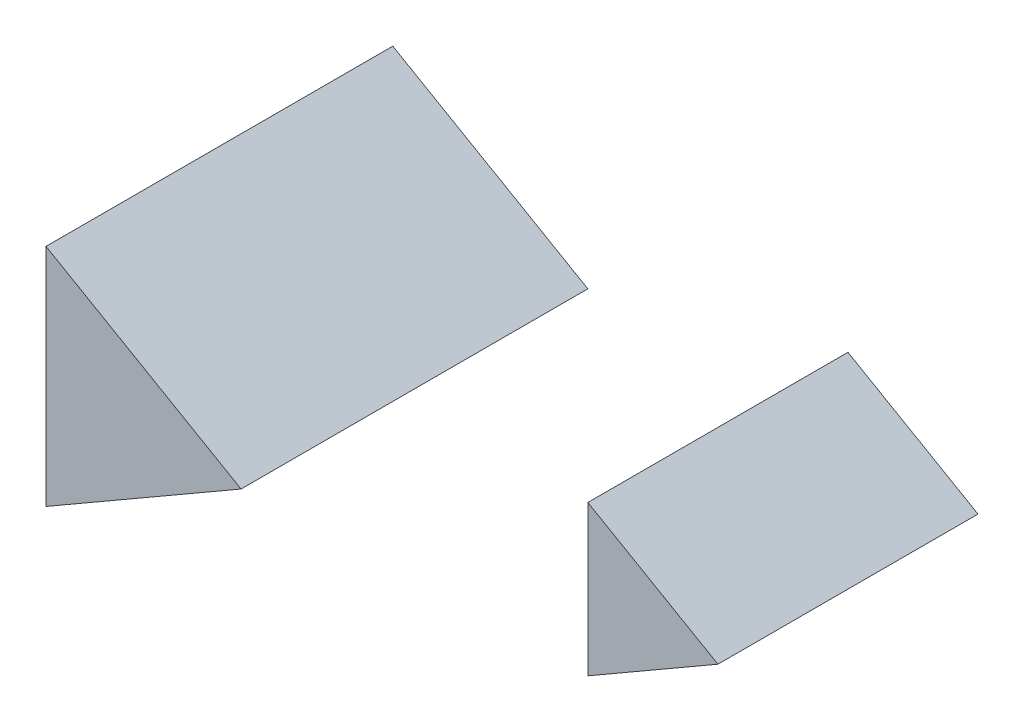
ISO-10303-21;
HEADER;
FILE_DESCRIPTION(('STEP AP214'),'2;1');
FILE_NAME('part.step','',(''),(''),'','','');
FILE_SCHEMA(('AUTOMOTIVE_DESIGN { 1 0 10303 214 1 1 1 1 }'));
ENDSEC;
DATA;
#1=APPLICATION_CONTEXT('core data for automotive mechanical design processes');
#2=APPLICATION_PROTOCOL_DEFINITION('international standard','automotive_design',2000,#1);
#3=PRODUCT_CONTEXT('',#1,'mechanical');
#4=PRODUCT('Part','Part','',(#3));
#5=PRODUCT_RELATED_PRODUCT_CATEGORY('part','',(#4));
#6=PRODUCT_DEFINITION_FORMATION('','',#4);
#7=PRODUCT_DEFINITION_CONTEXT('part definition',#1,'design');
#8=PRODUCT_DEFINITION('design','',#6,#7);
#9=PRODUCT_DEFINITION_SHAPE('','',#8);
#10=(LENGTH_UNIT() NAMED_UNIT(*) SI_UNIT(.MILLI.,.METRE.));
#11=(NAMED_UNIT(*) PLANE_ANGLE_UNIT() SI_UNIT($,.RADIAN.));
#12=(NAMED_UNIT(*) SI_UNIT($,.STERADIAN.) SOLID_ANGLE_UNIT());
#13=UNCERTAINTY_MEASURE_WITH_UNIT(LENGTH_MEASURE(1.E-05),#10,'distance_accuracy_value','');
#14=(GEOMETRIC_REPRESENTATION_CONTEXT(3) GLOBAL_UNCERTAINTY_ASSIGNED_CONTEXT((#13)) GLOBAL_UNIT_ASSIGNED_CONTEXT((#10,
#11,#12)) REPRESENTATION_CONTEXT('',''));
#15=CARTESIAN_POINT('',(0.,0.,0.));
#16=DIRECTION('',(0.,0.,1.));
#17=DIRECTION('',(1.,0.,0.));
#18=AXIS2_PLACEMENT_3D('',#15,#16,#17);
#19=CARTESIAN_POINT('',(400.000000000002,-173.205080756889,600.));
#20=DIRECTION('',(-0.500000000000004,0.866025403784436,0.));
#21=DIRECTION('',(-0.866025403784436,-0.500000000000004,0.));
#22=AXIS2_PLACEMENT_3D('',#19,#20,#21);
#23=PLANE('',#22);
#24=DIRECTION('',(0.866025403784436,0.500000000000004,0.));
#25=VECTOR('',#24,1.);
#26=CARTESIAN_POINT('',(400.000000000002,-173.205080756889,0.));
#27=LINE('',#26,#25);
#28=CARTESIAN_POINT('',(400.000000000002,-173.205080756889,0.));
#29=VERTEX_POINT('',#28);
#30=CARTESIAN_POINT('',(700.,0.,0.));
#31=VERTEX_POINT('',#30);
#32=EDGE_CURVE('E98',#29,#31,#27,.T.);
#33=ORIENTED_EDGE('',*,*,#32,.T.);
#34=DIRECTION('',(0.,0.,-1.));
#35=VECTOR('',#34,1.);
#36=CARTESIAN_POINT('',(700.,0.,600.));
#37=LINE('',#36,#35);
#38=CARTESIAN_POINT('',(700.,0.,600.));
#39=VERTEX_POINT('',#38);
#40=EDGE_CURVE('E12',#39,#31,#37,.T.);
#41=ORIENTED_EDGE('',*,*,#40,.F.);
#42=DIRECTION('',(0.866025403784436,0.500000000000004,0.));
#43=VECTOR('',#42,1.);
#44=CARTESIAN_POINT('',(400.000000000002,-173.205080756889,600.));
#45=LINE('',#44,#43);
#46=CARTESIAN_POINT('',(400.000000000002,-173.205080756889,600.));
#47=VERTEX_POINT('',#46);
#48=EDGE_CURVE('E91',#47,#39,#45,.T.);
#49=ORIENTED_EDGE('',*,*,#48,.F.);
#50=DIRECTION('',(0.,0.,-1.));
#51=VECTOR('',#50,1.);
#52=CARTESIAN_POINT('',(400.000000000002,-173.205080756889,600.));
#53=LINE('',#52,#51);
#54=EDGE_CURVE('E99',#47,#29,#53,.T.);
#55=ORIENTED_EDGE('',*,*,#54,.T.);
#56=EDGE_LOOP('',(#33,#41,#49,#55));
#57=FACE_BOUND('',#56,.T.);
#58=ADVANCED_FACE('F51',(#57),#23,.F.);
#59=CARTESIAN_POINT('',(700.,0.,600.));
#60=DIRECTION('',(-0.499999999999998,-0.86602540378444,0.));
#61=DIRECTION('',(0.86602540378444,-0.499999999999998,0.));
#62=AXIS2_PLACEMENT_3D('',#59,#60,#61);
#63=PLANE('',#62);
#64=DIRECTION('',(-0.86602540378444,0.499999999999998,0.));
#65=VECTOR('',#64,1.);
#66=CARTESIAN_POINT('',(700.,0.,0.));
#67=LINE('',#66,#65);
#68=CARTESIAN_POINT('',(399.999999999999,173.205080756887,0.));
#69=VERTEX_POINT('',#68);
#70=EDGE_CURVE('E79',#31,#69,#67,.T.);
#71=ORIENTED_EDGE('',*,*,#70,.T.);
#72=DIRECTION('',(0.,0.,-1.));
#73=VECTOR('',#72,1.);
#74=CARTESIAN_POINT('',(399.999999999999,173.205080756887,600.));
#75=LINE('',#74,#73);
#76=CARTESIAN_POINT('',(399.999999999999,173.205080756887,600.));
#77=VERTEX_POINT('',#76);
#78=EDGE_CURVE('E59',#77,#69,#75,.T.);
#79=ORIENTED_EDGE('',*,*,#78,.F.);
#80=DIRECTION('',(-0.86602540378444,0.499999999999998,0.));
#81=VECTOR('',#80,1.);
#82=CARTESIAN_POINT('',(700.,0.,600.));
#83=LINE('',#82,#81);
#84=EDGE_CURVE('E87',#39,#77,#83,.T.);
#85=ORIENTED_EDGE('',*,*,#84,.F.);
#86=ORIENTED_EDGE('',*,*,#40,.T.);
#87=EDGE_LOOP('',(#71,#79,#85,#86));
#88=FACE_BOUND('',#87,.T.);
#89=ADVANCED_FACE('F88',(#88),#63,.F.);
#90=CARTESIAN_POINT('',(399.999999999999,173.205080756887,600.));
#91=DIRECTION('',(1.,0.,0.));
#92=DIRECTION('',(0.,1.,0.));
#93=AXIS2_PLACEMENT_3D('',#90,#91,#92);
#94=PLANE('',#93);
#95=DIRECTION('',(0.,-1.,0.));
#96=VECTOR('',#95,1.);
#97=CARTESIAN_POINT('',(399.999999999999,173.205080756887,0.));
#98=LINE('',#97,#96);
#99=EDGE_CURVE('E84',#69,#29,#98,.T.);
#100=ORIENTED_EDGE('',*,*,#99,.T.);
#101=ORIENTED_EDGE('',*,*,#54,.F.);
#102=DIRECTION('',(0.,-1.,0.));
#103=VECTOR('',#102,1.);
#104=CARTESIAN_POINT('',(399.999999999999,173.205080756887,600.));
#105=LINE('',#104,#103);
#106=EDGE_CURVE('E67',#77,#47,#105,.T.);
#107=ORIENTED_EDGE('',*,*,#106,.F.);
#108=ORIENTED_EDGE('',*,*,#78,.T.);
#109=EDGE_LOOP('',(#100,#101,#107,#108));
#110=FACE_BOUND('',#109,.T.);
#111=ADVANCED_FACE('F106',(#110),#94,.F.);
#112=CARTESIAN_POINT('',(0.,0.,600.));
#113=DIRECTION('',(0.,0.,1.));
#114=DIRECTION('',(1.,0.,0.));
#115=AXIS2_PLACEMENT_3D('',#112,#113,#114);
#116=PLANE('',#115);
#117=ORIENTED_EDGE('',*,*,#48,.T.);
#118=ORIENTED_EDGE('',*,*,#84,.T.);
#119=ORIENTED_EDGE('',*,*,#106,.T.);
#120=EDGE_LOOP('',(#117,#118,#119));
#121=FACE_BOUND('',#120,.T.);
#122=ADVANCED_FACE('F94',(#121),#116,.T.);
#123=CARTESIAN_POINT('',(0.,0.,0.));
#124=DIRECTION('',(0.,0.,1.));
#125=DIRECTION('',(1.,0.,0.));
#126=AXIS2_PLACEMENT_3D('',#123,#124,#125);
#127=PLANE('',#126);
#128=ORIENTED_EDGE('',*,*,#32,.F.);
#129=ORIENTED_EDGE('',*,*,#99,.F.);
#130=ORIENTED_EDGE('',*,*,#70,.F.);
#131=EDGE_LOOP('',(#128,#129,#130));
#132=FACE_BOUND('',#131,.T.);
#133=ADVANCED_FACE('F107',(#132),#127,.F.);
#134=CLOSED_SHELL('',(#58,#89,#111,#122,#133));
#135=MANIFOLD_SOLID_BREP('B2',#134);
#136=CARTESIAN_POINT('',(-649.999999999998,-259.807621135333,800.));
#137=DIRECTION('',(-0.500000000000004,0.866025403784436,0.));
#138=DIRECTION('',(-0.866025403784436,-0.500000000000004,0.));
#139=AXIS2_PLACEMENT_3D('',#136,#137,#138);
#140=PLANE('',#139);
#141=DIRECTION('',(0.866025403784436,0.500000000000004,0.));
#142=VECTOR('',#141,1.);
#143=CARTESIAN_POINT('',(-649.999999999998,-259.807621135333,0.));
#144=LINE('',#143,#142);
#145=CARTESIAN_POINT('',(-649.999999999998,-259.807621135333,0.));
#146=VERTEX_POINT('',#145);
#147=CARTESIAN_POINT('',(-200.,0.,0.));
#148=VERTEX_POINT('',#147);
#149=EDGE_CURVE('E196',#146,#148,#144,.T.);
#150=ORIENTED_EDGE('',*,*,#149,.T.);
#151=DIRECTION('',(0.,0.,-1.));
#152=VECTOR('',#151,1.);
#153=CARTESIAN_POINT('',(-200.,0.,800.));
#154=LINE('',#153,#152);
#155=CARTESIAN_POINT('',(-200.,0.,800.));
#156=VERTEX_POINT('',#155);
#157=EDGE_CURVE('E49',#156,#148,#154,.T.);
#158=ORIENTED_EDGE('',*,*,#157,.F.);
#159=DIRECTION('',(0.866025403784436,0.500000000000004,0.));
#160=VECTOR('',#159,1.);
#161=CARTESIAN_POINT('',(-649.999999999998,-259.807621135333,800.));
#162=LINE('',#161,#160);
#163=CARTESIAN_POINT('',(-649.999999999998,-259.807621135333,800.));
#164=VERTEX_POINT('',#163);
#165=EDGE_CURVE('E189',#164,#156,#162,.T.);
#166=ORIENTED_EDGE('',*,*,#165,.F.);
#167=DIRECTION('',(0.,0.,-1.));
#168=VECTOR('',#167,1.);
#169=CARTESIAN_POINT('',(-649.999999999998,-259.807621135333,800.));
#170=LINE('',#169,#168);
#171=EDGE_CURVE('E197',#164,#146,#170,.T.);
#172=ORIENTED_EDGE('',*,*,#171,.T.);
#173=EDGE_LOOP('',(#150,#158,#166,#172));
#174=FACE_BOUND('',#173,.T.);
#175=ADVANCED_FACE('F149',(#174),#140,.F.);
#176=CARTESIAN_POINT('',(-200.,0.,800.));
#177=DIRECTION('',(-0.499999999999998,-0.86602540378444,0.));
#178=DIRECTION('',(0.86602540378444,-0.499999999999998,0.));
#179=AXIS2_PLACEMENT_3D('',#176,#177,#178);
#180=PLANE('',#179);
#181=DIRECTION('',(-0.86602540378444,0.499999999999998,0.));
#182=VECTOR('',#181,1.);
#183=CARTESIAN_POINT('',(-200.,0.,0.));
#184=LINE('',#183,#182);
#185=CARTESIAN_POINT('',(-650.000000000001,259.807621135331,0.));
#186=VERTEX_POINT('',#185);
#187=EDGE_CURVE('E177',#148,#186,#184,.T.);
#188=ORIENTED_EDGE('',*,*,#187,.T.);
#189=DIRECTION('',(0.,0.,-1.));
#190=VECTOR('',#189,1.);
#191=CARTESIAN_POINT('',(-650.000000000001,259.807621135331,800.));
#192=LINE('',#191,#190);
#193=CARTESIAN_POINT('',(-650.000000000001,259.807621135331,800.));
#194=VERTEX_POINT('',#193);
#195=EDGE_CURVE('E157',#194,#186,#192,.T.);
#196=ORIENTED_EDGE('',*,*,#195,.F.);
#197=DIRECTION('',(-0.86602540378444,0.499999999999998,0.));
#198=VECTOR('',#197,1.);
#199=CARTESIAN_POINT('',(-200.,0.,800.));
#200=LINE('',#199,#198);
#201=EDGE_CURVE('E185',#156,#194,#200,.T.);
#202=ORIENTED_EDGE('',*,*,#201,.F.);
#203=ORIENTED_EDGE('',*,*,#157,.T.);
#204=EDGE_LOOP('',(#188,#196,#202,#203));
#205=FACE_BOUND('',#204,.T.);
#206=ADVANCED_FACE('F186',(#205),#180,.F.);
#207=CARTESIAN_POINT('',(-650.000000000001,259.807621135331,800.));
#208=DIRECTION('',(1.,0.,0.));
#209=DIRECTION('',(0.,1.,0.));
#210=AXIS2_PLACEMENT_3D('',#207,#208,#209);
#211=PLANE('',#210);
#212=DIRECTION('',(0.,-1.,0.));
#213=VECTOR('',#212,1.);
#214=CARTESIAN_POINT('',(-650.000000000001,259.807621135331,0.));
#215=LINE('',#214,#213);
#216=EDGE_CURVE('E182',#186,#146,#215,.T.);
#217=ORIENTED_EDGE('',*,*,#216,.T.);
#218=ORIENTED_EDGE('',*,*,#171,.F.);
#219=DIRECTION('',(0.,-1.,0.));
#220=VECTOR('',#219,1.);
#221=CARTESIAN_POINT('',(-650.000000000001,259.807621135331,800.));
#222=LINE('',#221,#220);
#223=EDGE_CURVE('E165',#194,#164,#222,.T.);
#224=ORIENTED_EDGE('',*,*,#223,.F.);
#225=ORIENTED_EDGE('',*,*,#195,.T.);
#226=EDGE_LOOP('',(#217,#218,#224,#225));
#227=FACE_BOUND('',#226,.T.);
#228=ADVANCED_FACE('F204',(#227),#211,.F.);
#229=CARTESIAN_POINT('',(0.,0.,800.));
#230=DIRECTION('',(0.,0.,1.));
#231=DIRECTION('',(1.,0.,0.));
#232=AXIS2_PLACEMENT_3D('',#229,#230,#231);
#233=PLANE('',#232);
#234=ORIENTED_EDGE('',*,*,#165,.T.);
#235=ORIENTED_EDGE('',*,*,#201,.T.);
#236=ORIENTED_EDGE('',*,*,#223,.T.);
#237=EDGE_LOOP('',(#234,#235,#236));
#238=FACE_BOUND('',#237,.T.);
#239=ADVANCED_FACE('F192',(#238),#233,.T.);
#240=CARTESIAN_POINT('',(0.,0.,0.));
#241=DIRECTION('',(0.,0.,1.));
#242=DIRECTION('',(1.,0.,0.));
#243=AXIS2_PLACEMENT_3D('',#240,#241,#242);
#244=PLANE('',#243);
#245=ORIENTED_EDGE('',*,*,#149,.F.);
#246=ORIENTED_EDGE('',*,*,#216,.F.);
#247=ORIENTED_EDGE('',*,*,#187,.F.);
#248=EDGE_LOOP('',(#245,#246,#247));
#249=FACE_BOUND('',#248,.T.);
#250=ADVANCED_FACE('F205',(#249),#244,.F.);
#251=CLOSED_SHELL('',(#175,#206,#228,#239,#250));
#252=MANIFOLD_SOLID_BREP('B6',#251);
#253=ADVANCED_BREP_SHAPE_REPRESENTATION('',(#18,#135,#252),#14);
#254=SHAPE_DEFINITION_REPRESENTATION(#9,#253);
ENDSEC;
END-ISO-10303-21;
